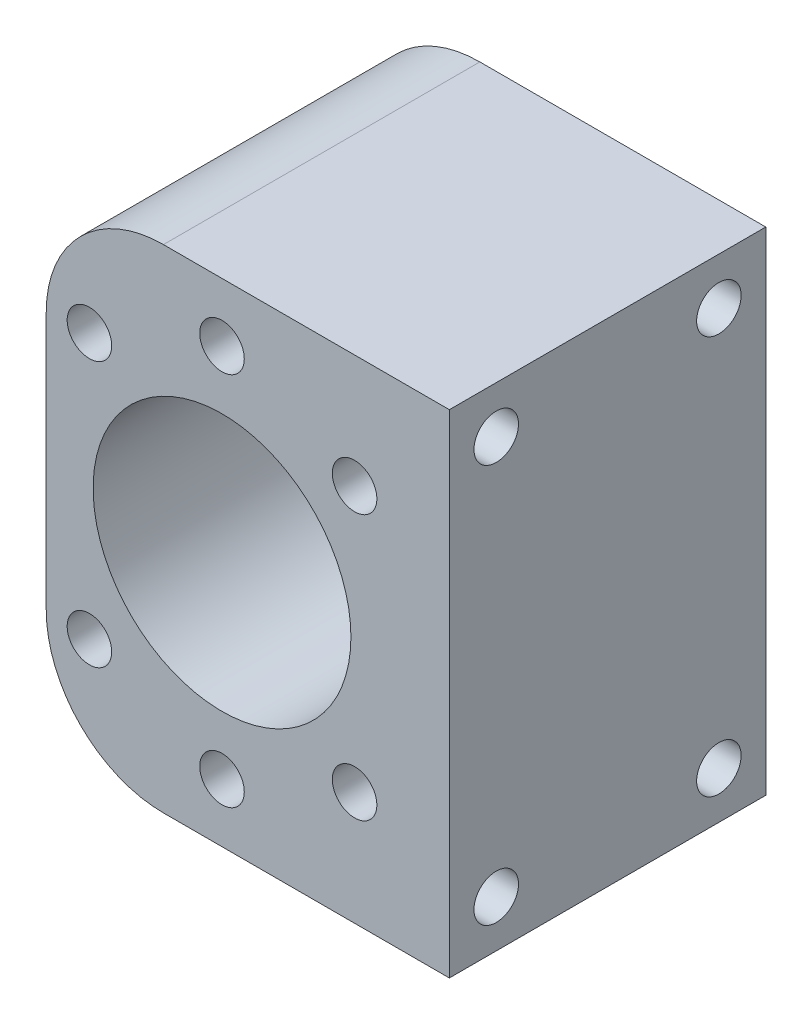
ISO-10303-21;
HEADER;
FILE_DESCRIPTION(('STEP AP214'),'2;1');
FILE_NAME('part.step','',(''),(''),'','','');
FILE_SCHEMA(('AUTOMOTIVE_DESIGN { 1 0 10303 214 1 1 1 1 }'));
ENDSEC;
DATA;
#1=APPLICATION_CONTEXT('core data for automotive mechanical design processes');
#2=APPLICATION_PROTOCOL_DEFINITION('international standard','automotive_design',2000,#1);
#3=PRODUCT_CONTEXT('',#1,'mechanical');
#4=PRODUCT('Part','Part','',(#3));
#5=PRODUCT_RELATED_PRODUCT_CATEGORY('part','',(#4));
#6=PRODUCT_DEFINITION_FORMATION('','',#4);
#7=PRODUCT_DEFINITION_CONTEXT('part definition',#1,'design');
#8=PRODUCT_DEFINITION('design','',#6,#7);
#9=PRODUCT_DEFINITION_SHAPE('','',#8);
#10=(LENGTH_UNIT() NAMED_UNIT(*) SI_UNIT(.MILLI.,.METRE.));
#11=(NAMED_UNIT(*) PLANE_ANGLE_UNIT() SI_UNIT($,.RADIAN.));
#12=(NAMED_UNIT(*) SI_UNIT($,.STERADIAN.) SOLID_ANGLE_UNIT());
#13=UNCERTAINTY_MEASURE_WITH_UNIT(LENGTH_MEASURE(1.E-05),#10,'distance_accuracy_value','');
#14=(GEOMETRIC_REPRESENTATION_CONTEXT(3) GLOBAL_UNCERTAINTY_ASSIGNED_CONTEXT((#13)) GLOBAL_UNIT_ASSIGNED_CONTEXT((#10,
#11,#12)) REPRESENTATION_CONTEXT('',''));
#15=CARTESIAN_POINT('',(0.,0.,0.));
#16=DIRECTION('',(0.,0.,1.));
#17=DIRECTION('',(1.,0.,0.));
#18=AXIS2_PLACEMENT_3D('',#15,#16,#17);
#19=CARTESIAN_POINT('',(-15.,21.,13.5));
#20=DIRECTION('',(0.,-1.,0.));
#21=DIRECTION('',(0.,0.,-1.));
#22=AXIS2_PLACEMENT_3D('',#19,#20,#21);
#23=PLANE('',#22);
#24=DIRECTION('',(-1.,0.,0.));
#25=VECTOR('',#24,1.);
#26=CARTESIAN_POINT('',(-15.,21.,-13.5));
#27=LINE('',#26,#25);
#28=CARTESIAN_POINT('',(19.4,21.,-13.5));
#29=VERTEX_POINT('',#28);
#30=CARTESIAN_POINT('',(-4.99999999999999,21.,-13.5));
#31=VERTEX_POINT('',#30);
#32=EDGE_CURVE('E88',#29,#31,#27,.T.);
#33=ORIENTED_EDGE('',*,*,#32,.T.);
#34=DIRECTION('',(0.,0.,-1.));
#35=VECTOR('',#34,1.);
#36=CARTESIAN_POINT('',(-4.99999999999999,21.,13.5));
#37=LINE('',#36,#35);
#38=CARTESIAN_POINT('',(-4.99999999999999,21.,13.5));
#39=VERTEX_POINT('',#38);
#40=EDGE_CURVE('E11',#31,#39,#37,.F.);
#41=ORIENTED_EDGE('',*,*,#40,.T.);
#42=DIRECTION('',(-1.,0.,0.));
#43=VECTOR('',#42,1.);
#44=CARTESIAN_POINT('',(-15.,21.,13.5));
#45=LINE('',#44,#43);
#46=CARTESIAN_POINT('',(19.4,21.,13.5));
#47=VERTEX_POINT('',#46);
#48=EDGE_CURVE('E101',#47,#39,#45,.T.);
#49=ORIENTED_EDGE('',*,*,#48,.F.);
#50=DIRECTION('',(0.,0.,1.));
#51=VECTOR('',#50,1.);
#52=CARTESIAN_POINT('',(19.4,21.,-13.5));
#53=LINE('',#52,#51);
#54=EDGE_CURVE('E100',#29,#47,#53,.T.);
#55=ORIENTED_EDGE('',*,*,#54,.F.);
#56=EDGE_LOOP('',(#33,#41,#49,#55));
#57=FACE_BOUND('',#56,.T.);
#58=ADVANCED_FACE('F35',(#57),#23,.F.);
#59=CARTESIAN_POINT('',(-15.,-21.,13.5));
#60=DIRECTION('',(1.,0.,0.));
#61=DIRECTION('',(0.,0.,-1.));
#62=AXIS2_PLACEMENT_3D('',#59,#60,#61);
#63=PLANE('',#62);
#64=DIRECTION('',(0.,-1.,0.));
#65=VECTOR('',#64,1.);
#66=CARTESIAN_POINT('',(-15.,-21.,-13.5));
#67=LINE('',#66,#65);
#68=CARTESIAN_POINT('',(-15.,11.,-13.5));
#69=VERTEX_POINT('',#68);
#70=CARTESIAN_POINT('',(-15.,-11.,-13.5));
#71=VERTEX_POINT('',#70);
#72=EDGE_CURVE('E96',#69,#71,#67,.T.);
#73=ORIENTED_EDGE('',*,*,#72,.T.);
#74=DIRECTION('',(0.,0.,-1.));
#75=VECTOR('',#74,1.);
#76=CARTESIAN_POINT('',(-15.,-11.,13.5));
#77=LINE('',#76,#75);
#78=CARTESIAN_POINT('',(-15.,-11.,13.5));
#79=VERTEX_POINT('',#78);
#80=EDGE_CURVE('E56',#71,#79,#77,.F.);
#81=ORIENTED_EDGE('',*,*,#80,.T.);
#82=DIRECTION('',(0.,-1.,0.));
#83=VECTOR('',#82,1.);
#84=CARTESIAN_POINT('',(-15.,-21.,13.5));
#85=LINE('',#84,#83);
#86=CARTESIAN_POINT('',(-15.,11.,13.5));
#87=VERTEX_POINT('',#86);
#88=EDGE_CURVE('E162',#87,#79,#85,.T.);
#89=ORIENTED_EDGE('',*,*,#88,.F.);
#90=DIRECTION('',(0.,0.,-1.));
#91=VECTOR('',#90,1.);
#92=CARTESIAN_POINT('',(-15.,11.,13.5));
#93=LINE('',#92,#91);
#94=EDGE_CURVE('E175',#87,#69,#93,.T.);
#95=ORIENTED_EDGE('',*,*,#94,.T.);
#96=EDGE_LOOP('',(#73,#81,#89,#95));
#97=FACE_BOUND('',#96,.T.);
#98=ADVANCED_FACE('F189',(#97),#63,.F.);
#99=CARTESIAN_POINT('',(-15.,-21.,13.5));
#100=DIRECTION('',(0.,1.,0.));
#101=DIRECTION('',(0.,0.,1.));
#102=AXIS2_PLACEMENT_3D('',#99,#100,#101);
#103=PLANE('',#102);
#104=DIRECTION('',(1.,0.,0.));
#105=VECTOR('',#104,1.);
#106=CARTESIAN_POINT('',(-15.,-21.,13.5));
#107=LINE('',#106,#105);
#108=CARTESIAN_POINT('',(-4.99999999999999,-21.,13.5));
#109=VERTEX_POINT('',#108);
#110=CARTESIAN_POINT('',(19.4,-21.,13.5));
#111=VERTEX_POINT('',#110);
#112=EDGE_CURVE('E165',#109,#111,#107,.T.);
#113=ORIENTED_EDGE('',*,*,#112,.F.);
#114=DIRECTION('',(0.,0.,-1.));
#115=VECTOR('',#114,1.);
#116=CARTESIAN_POINT('',(-4.99999999999999,-21.,13.5));
#117=LINE('',#116,#115);
#118=CARTESIAN_POINT('',(-4.99999999999999,-21.,-13.5));
#119=VERTEX_POINT('',#118);
#120=EDGE_CURVE('E166',#109,#119,#117,.T.);
#121=ORIENTED_EDGE('',*,*,#120,.T.);
#122=DIRECTION('',(1.,0.,0.));
#123=VECTOR('',#122,1.);
#124=CARTESIAN_POINT('',(-15.,-21.,-13.5));
#125=LINE('',#124,#123);
#126=CARTESIAN_POINT('',(19.4,-21.,-13.5));
#127=VERTEX_POINT('',#126);
#128=EDGE_CURVE('E163',#119,#127,#125,.T.);
#129=ORIENTED_EDGE('',*,*,#128,.T.);
#130=DIRECTION('',(0.,0.,-1.));
#131=VECTOR('',#130,1.);
#132=CARTESIAN_POINT('',(19.4,-21.,-13.5));
#133=LINE('',#132,#131);
#134=EDGE_CURVE('E110',#111,#127,#133,.T.);
#135=ORIENTED_EDGE('',*,*,#134,.F.);
#136=EDGE_LOOP('',(#113,#121,#129,#135));
#137=FACE_BOUND('',#136,.T.);
#138=ADVANCED_FACE('F187',(#137),#103,.F.);
#139=CARTESIAN_POINT('',(0.,0.,13.5));
#140=DIRECTION('',(0.,0.,-1.));
#141=DIRECTION('',(-1.,0.,0.));
#142=AXIS2_PLACEMENT_3D('',#139,#140,#141);
#143=PLANE('',#142);
#144=CARTESIAN_POINT('',(-11.3137084989847,-11.3137084989848,13.5));
#145=DIRECTION('',(0.,0.,1.));
#146=DIRECTION('',(1.,0.,0.));
#147=AXIS2_PLACEMENT_3D('',#144,#145,#146);
#148=CIRCLE('',#147,1.9);
#149=CARTESIAN_POINT('',(-9.4137084989847,-11.3137084989848,13.5));
#150=VERTEX_POINT('',#149);
#151=EDGE_CURVE('E120',#150,#150,#148,.T.);
#152=ORIENTED_EDGE('',*,*,#151,.F.);
#153=EDGE_LOOP('',(#152));
#154=FACE_BOUND('',#153,.T.);
#155=CARTESIAN_POINT('',(0.,-16.,13.5));
#156=DIRECTION('',(0.,0.,1.));
#157=DIRECTION('',(1.,0.,0.));
#158=AXIS2_PLACEMENT_3D('',#155,#156,#157);
#159=CIRCLE('',#158,1.9);
#160=CARTESIAN_POINT('',(1.9,-16.,13.5));
#161=VERTEX_POINT('',#160);
#162=EDGE_CURVE('E124',#161,#161,#159,.T.);
#163=ORIENTED_EDGE('',*,*,#162,.F.);
#164=EDGE_LOOP('',(#163));
#165=FACE_BOUND('',#164,.T.);
#166=CARTESIAN_POINT('',(11.3137084989847,-11.3137084989848,13.5));
#167=DIRECTION('',(0.,0.,1.));
#168=DIRECTION('',(1.,0.,0.));
#169=AXIS2_PLACEMENT_3D('',#166,#167,#168);
#170=CIRCLE('',#169,1.9);
#171=CARTESIAN_POINT('',(13.2137084989847,-11.3137084989848,13.5));
#172=VERTEX_POINT('',#171);
#173=EDGE_CURVE('E130',#172,#172,#170,.T.);
#174=ORIENTED_EDGE('',*,*,#173,.F.);
#175=EDGE_LOOP('',(#174));
#176=FACE_BOUND('',#175,.T.);
#177=CARTESIAN_POINT('',(11.3137084989847,11.3137084989848,13.5));
#178=DIRECTION('',(0.,0.,1.));
#179=DIRECTION('',(1.,0.,0.));
#180=AXIS2_PLACEMENT_3D('',#177,#178,#179);
#181=CIRCLE('',#180,1.9);
#182=CARTESIAN_POINT('',(13.2137084989847,11.3137084989848,13.5));
#183=VERTEX_POINT('',#182);
#184=EDGE_CURVE('E136',#183,#183,#181,.T.);
#185=ORIENTED_EDGE('',*,*,#184,.F.);
#186=EDGE_LOOP('',(#185));
#187=FACE_BOUND('',#186,.T.);
#188=CARTESIAN_POINT('',(0.,16.,13.5));
#189=DIRECTION('',(0.,0.,1.));
#190=DIRECTION('',(1.,0.,0.));
#191=AXIS2_PLACEMENT_3D('',#188,#189,#190);
#192=CIRCLE('',#191,1.9);
#193=CARTESIAN_POINT('',(1.9,16.,13.5));
#194=VERTEX_POINT('',#193);
#195=EDGE_CURVE('E142',#194,#194,#192,.T.);
#196=ORIENTED_EDGE('',*,*,#195,.F.);
#197=EDGE_LOOP('',(#196));
#198=FACE_BOUND('',#197,.T.);
#199=CARTESIAN_POINT('',(-11.3137084989847,11.3137084989848,13.5));
#200=DIRECTION('',(0.,0.,1.));
#201=DIRECTION('',(1.,0.,0.));
#202=AXIS2_PLACEMENT_3D('',#199,#200,#201);
#203=CIRCLE('',#202,1.9);
#204=CARTESIAN_POINT('',(-9.4137084989847,11.3137084989848,13.5));
#205=VERTEX_POINT('',#204);
#206=EDGE_CURVE('E148',#205,#205,#203,.T.);
#207=ORIENTED_EDGE('',*,*,#206,.F.);
#208=EDGE_LOOP('',(#207));
#209=FACE_BOUND('',#208,.T.);
#210=CARTESIAN_POINT('',(0.,0.,13.5));
#211=DIRECTION('',(0.,0.,1.));
#212=DIRECTION('',(1.,0.,0.));
#213=AXIS2_PLACEMENT_3D('',#210,#211,#212);
#214=CIRCLE('',#213,11.);
#215=CARTESIAN_POINT('',(11.,0.,13.5));
#216=VERTEX_POINT('',#215);
#217=EDGE_CURVE('E154',#216,#216,#214,.T.);
#218=ORIENTED_EDGE('',*,*,#217,.F.);
#219=EDGE_LOOP('',(#218));
#220=FACE_BOUND('',#219,.T.);
#221=ORIENTED_EDGE('',*,*,#88,.T.);
#222=CARTESIAN_POINT('',(-4.99999999999999,-11.,13.5));
#223=DIRECTION('',(0.,0.,-1.));
#224=DIRECTION('',(-1.,0.,0.));
#225=AXIS2_PLACEMENT_3D('',#222,#223,#224);
#226=CIRCLE('',#225,10.);
#227=EDGE_CURVE('E43',#79,#109,#226,.F.);
#228=ORIENTED_EDGE('',*,*,#227,.T.);
#229=ORIENTED_EDGE('',*,*,#112,.T.);
#230=DIRECTION('',(0.,-1.,0.));
#231=VECTOR('',#230,1.);
#232=CARTESIAN_POINT('',(19.4,21.,13.5));
#233=LINE('',#232,#231);
#234=EDGE_CURVE('E105',#47,#111,#233,.T.);
#235=ORIENTED_EDGE('',*,*,#234,.F.);
#236=ORIENTED_EDGE('',*,*,#48,.T.);
#237=CARTESIAN_POINT('',(-4.99999999999999,11.,13.5));
#238=DIRECTION('',(0.,0.,-1.));
#239=DIRECTION('',(-1.,0.,0.));
#240=AXIS2_PLACEMENT_3D('',#237,#238,#239);
#241=CIRCLE('',#240,10.);
#242=EDGE_CURVE('E179',#39,#87,#241,.F.);
#243=ORIENTED_EDGE('',*,*,#242,.T.);
#244=EDGE_LOOP('',(#221,#228,#229,#235,#236,#243));
#245=FACE_BOUND('',#244,.T.);
#246=ADVANCED_FACE('F183',(#154,#165,#176,#187,#198,#209,#220,#245),#143,.F.);
#247=CARTESIAN_POINT('',(0.,0.,-13.5));
#248=DIRECTION('',(0.,0.,-1.));
#249=DIRECTION('',(-1.,0.,0.));
#250=AXIS2_PLACEMENT_3D('',#247,#248,#249);
#251=PLANE('',#250);
#252=CARTESIAN_POINT('',(0.,0.,-13.5));
#253=DIRECTION('',(0.,0.,1.));
#254=DIRECTION('',(1.,0.,0.));
#255=AXIS2_PLACEMENT_3D('',#252,#253,#254);
#256=CIRCLE('',#255,11.);
#257=CARTESIAN_POINT('',(11.,0.,-13.5));
#258=VERTEX_POINT('',#257);
#259=EDGE_CURVE('E97',#258,#258,#256,.T.);
#260=ORIENTED_EDGE('',*,*,#259,.T.);
#261=EDGE_LOOP('',(#260));
#262=FACE_BOUND('',#261,.T.);
#263=ORIENTED_EDGE('',*,*,#128,.F.);
#264=CARTESIAN_POINT('',(-4.99999999999999,-11.,-13.5));
#265=DIRECTION('',(0.,0.,-1.));
#266=DIRECTION('',(-1.,0.,0.));
#267=AXIS2_PLACEMENT_3D('',#264,#265,#266);
#268=CIRCLE('',#267,10.);
#269=EDGE_CURVE('E173',#119,#71,#268,.T.);
#270=ORIENTED_EDGE('',*,*,#269,.T.);
#271=ORIENTED_EDGE('',*,*,#72,.F.);
#272=CARTESIAN_POINT('',(-4.99999999999999,11.,-13.5));
#273=DIRECTION('',(0.,0.,-1.));
#274=DIRECTION('',(-1.,0.,0.));
#275=AXIS2_PLACEMENT_3D('',#272,#273,#274);
#276=CIRCLE('',#275,10.);
#277=EDGE_CURVE('E95',#69,#31,#276,.T.);
#278=ORIENTED_EDGE('',*,*,#277,.T.);
#279=ORIENTED_EDGE('',*,*,#32,.F.);
#280=DIRECTION('',(0.,1.,0.));
#281=VECTOR('',#280,1.);
#282=CARTESIAN_POINT('',(19.4,21.,-13.5));
#283=LINE('',#282,#281);
#284=EDGE_CURVE('E93',#127,#29,#283,.T.);
#285=ORIENTED_EDGE('',*,*,#284,.F.);
#286=EDGE_LOOP('',(#263,#270,#271,#278,#279,#285));
#287=FACE_BOUND('',#286,.T.);
#288=ADVANCED_FACE('F91',(#262,#287),#251,.T.);
#289=CARTESIAN_POINT('',(0.,0.,-13.5));
#290=DIRECTION('',(0.,0.,1.));
#291=DIRECTION('',(1.,0.,0.));
#292=AXIS2_PLACEMENT_3D('',#289,#290,#291);
#293=CYLINDRICAL_SURFACE('',#292,11.);
#294=ORIENTED_EDGE('',*,*,#259,.F.);
#295=EDGE_LOOP('',(#294));
#296=FACE_BOUND('',#295,.T.);
#297=ORIENTED_EDGE('',*,*,#217,.T.);
#298=EDGE_LOOP('',(#297));
#299=FACE_BOUND('',#298,.T.);
#300=ADVANCED_FACE('F210',(#296,#299),#293,.F.);
#301=CARTESIAN_POINT('',(-11.3137084989847,11.3137084989848,3.5));
#302=DIRECTION('',(0.,0.,1.));
#303=DIRECTION('',(1.,0.,0.));
#304=AXIS2_PLACEMENT_3D('',#301,#302,#303);
#305=CYLINDRICAL_SURFACE('',#304,1.9);
#306=CARTESIAN_POINT('',(-11.3137084989847,11.3137084989848,3.5));
#307=DIRECTION('',(0.,0.,1.));
#308=DIRECTION('',(1.,0.,0.));
#309=AXIS2_PLACEMENT_3D('',#306,#307,#308);
#310=CIRCLE('',#309,1.9);
#311=CARTESIAN_POINT('',(-9.4137084989847,11.3137084989848,3.5));
#312=VERTEX_POINT('',#311);
#313=EDGE_CURVE('E151',#312,#312,#310,.T.);
#314=ORIENTED_EDGE('',*,*,#313,.F.);
#315=EDGE_LOOP('',(#314));
#316=FACE_BOUND('',#315,.T.);
#317=ORIENTED_EDGE('',*,*,#206,.T.);
#318=EDGE_LOOP('',(#317));
#319=FACE_BOUND('',#318,.T.);
#320=ADVANCED_FACE('F217',(#316,#319),#305,.F.);
#321=CARTESIAN_POINT('',(-11.3137084989847,11.3137084989848,3.5));
#322=DIRECTION('',(0.,0.,1.));
#323=DIRECTION('',(1.,0.,0.));
#324=AXIS2_PLACEMENT_3D('',#321,#322,#323);
#325=PLANE('',#324);
#326=ORIENTED_EDGE('',*,*,#313,.T.);
#327=EDGE_LOOP('',(#326));
#328=FACE_BOUND('',#327,.T.);
#329=ADVANCED_FACE('F221',(#328),#325,.T.);
#330=CARTESIAN_POINT('',(0.,16.,3.5));
#331=DIRECTION('',(0.,0.,1.));
#332=DIRECTION('',(1.,0.,0.));
#333=AXIS2_PLACEMENT_3D('',#330,#331,#332);
#334=CYLINDRICAL_SURFACE('',#333,1.9);
#335=CARTESIAN_POINT('',(0.,16.,3.5));
#336=DIRECTION('',(0.,0.,1.));
#337=DIRECTION('',(1.,0.,0.));
#338=AXIS2_PLACEMENT_3D('',#335,#336,#337);
#339=CIRCLE('',#338,1.9);
#340=CARTESIAN_POINT('',(1.9,16.,3.5));
#341=VERTEX_POINT('',#340);
#342=EDGE_CURVE('E145',#341,#341,#339,.T.);
#343=ORIENTED_EDGE('',*,*,#342,.F.);
#344=EDGE_LOOP('',(#343));
#345=FACE_BOUND('',#344,.T.);
#346=ORIENTED_EDGE('',*,*,#195,.T.);
#347=EDGE_LOOP('',(#346));
#348=FACE_BOUND('',#347,.T.);
#349=ADVANCED_FACE('F225',(#345,#348),#334,.F.);
#350=CARTESIAN_POINT('',(0.,16.,3.5));
#351=DIRECTION('',(0.,0.,1.));
#352=DIRECTION('',(1.,0.,0.));
#353=AXIS2_PLACEMENT_3D('',#350,#351,#352);
#354=PLANE('',#353);
#355=ORIENTED_EDGE('',*,*,#342,.T.);
#356=EDGE_LOOP('',(#355));
#357=FACE_BOUND('',#356,.T.);
#358=ADVANCED_FACE('F229',(#357),#354,.T.);
#359=CARTESIAN_POINT('',(11.3137084989847,11.3137084989848,3.5));
#360=DIRECTION('',(0.,0.,1.));
#361=DIRECTION('',(1.,0.,0.));
#362=AXIS2_PLACEMENT_3D('',#359,#360,#361);
#363=CYLINDRICAL_SURFACE('',#362,1.9);
#364=CARTESIAN_POINT('',(11.3137084989847,11.3137084989848,3.5));
#365=DIRECTION('',(0.,0.,1.));
#366=DIRECTION('',(1.,0.,0.));
#367=AXIS2_PLACEMENT_3D('',#364,#365,#366);
#368=CIRCLE('',#367,1.9);
#369=CARTESIAN_POINT('',(13.2137084989847,11.3137084989848,3.5));
#370=VERTEX_POINT('',#369);
#371=EDGE_CURVE('E139',#370,#370,#368,.T.);
#372=ORIENTED_EDGE('',*,*,#371,.F.);
#373=EDGE_LOOP('',(#372));
#374=FACE_BOUND('',#373,.T.);
#375=ORIENTED_EDGE('',*,*,#184,.T.);
#376=EDGE_LOOP('',(#375));
#377=FACE_BOUND('',#376,.T.);
#378=ADVANCED_FACE('F233',(#374,#377),#363,.F.);
#379=CARTESIAN_POINT('',(11.3137084989847,11.3137084989848,3.5));
#380=DIRECTION('',(0.,0.,1.));
#381=DIRECTION('',(1.,0.,0.));
#382=AXIS2_PLACEMENT_3D('',#379,#380,#381);
#383=PLANE('',#382);
#384=ORIENTED_EDGE('',*,*,#371,.T.);
#385=EDGE_LOOP('',(#384));
#386=FACE_BOUND('',#385,.T.);
#387=ADVANCED_FACE('F237',(#386),#383,.T.);
#388=CARTESIAN_POINT('',(11.3137084989847,-11.3137084989848,3.5));
#389=DIRECTION('',(0.,0.,1.));
#390=DIRECTION('',(1.,0.,0.));
#391=AXIS2_PLACEMENT_3D('',#388,#389,#390);
#392=CYLINDRICAL_SURFACE('',#391,1.9);
#393=CARTESIAN_POINT('',(11.3137084989847,-11.3137084989848,3.5));
#394=DIRECTION('',(0.,0.,1.));
#395=DIRECTION('',(1.,0.,0.));
#396=AXIS2_PLACEMENT_3D('',#393,#394,#395);
#397=CIRCLE('',#396,1.9);
#398=CARTESIAN_POINT('',(13.2137084989847,-11.3137084989848,3.5));
#399=VERTEX_POINT('',#398);
#400=EDGE_CURVE('E133',#399,#399,#397,.T.);
#401=ORIENTED_EDGE('',*,*,#400,.F.);
#402=EDGE_LOOP('',(#401));
#403=FACE_BOUND('',#402,.T.);
#404=ORIENTED_EDGE('',*,*,#173,.T.);
#405=EDGE_LOOP('',(#404));
#406=FACE_BOUND('',#405,.T.);
#407=ADVANCED_FACE('F241',(#403,#406),#392,.F.);
#408=CARTESIAN_POINT('',(11.3137084989847,-11.3137084989848,3.5));
#409=DIRECTION('',(0.,0.,1.));
#410=DIRECTION('',(1.,0.,0.));
#411=AXIS2_PLACEMENT_3D('',#408,#409,#410);
#412=PLANE('',#411);
#413=ORIENTED_EDGE('',*,*,#400,.T.);
#414=EDGE_LOOP('',(#413));
#415=FACE_BOUND('',#414,.T.);
#416=ADVANCED_FACE('F245',(#415),#412,.T.);
#417=CARTESIAN_POINT('',(0.,-16.,3.5));
#418=DIRECTION('',(0.,0.,1.));
#419=DIRECTION('',(1.,0.,0.));
#420=AXIS2_PLACEMENT_3D('',#417,#418,#419);
#421=CYLINDRICAL_SURFACE('',#420,1.9);
#422=CARTESIAN_POINT('',(0.,-16.,3.5));
#423=DIRECTION('',(0.,0.,1.));
#424=DIRECTION('',(1.,0.,0.));
#425=AXIS2_PLACEMENT_3D('',#422,#423,#424);
#426=CIRCLE('',#425,1.9);
#427=CARTESIAN_POINT('',(1.9,-16.,3.5));
#428=VERTEX_POINT('',#427);
#429=EDGE_CURVE('E127',#428,#428,#426,.T.);
#430=ORIENTED_EDGE('',*,*,#429,.F.);
#431=EDGE_LOOP('',(#430));
#432=FACE_BOUND('',#431,.T.);
#433=ORIENTED_EDGE('',*,*,#162,.T.);
#434=EDGE_LOOP('',(#433));
#435=FACE_BOUND('',#434,.T.);
#436=ADVANCED_FACE('F249',(#432,#435),#421,.F.);
#437=CARTESIAN_POINT('',(0.,-16.,3.5));
#438=DIRECTION('',(0.,0.,1.));
#439=DIRECTION('',(1.,0.,0.));
#440=AXIS2_PLACEMENT_3D('',#437,#438,#439);
#441=PLANE('',#440);
#442=ORIENTED_EDGE('',*,*,#429,.T.);
#443=EDGE_LOOP('',(#442));
#444=FACE_BOUND('',#443,.T.);
#445=ADVANCED_FACE('F253',(#444),#441,.T.);
#446=CARTESIAN_POINT('',(-11.3137084989847,-11.3137084989848,3.5));
#447=DIRECTION('',(0.,0.,1.));
#448=DIRECTION('',(1.,0.,0.));
#449=AXIS2_PLACEMENT_3D('',#446,#447,#448);
#450=CYLINDRICAL_SURFACE('',#449,1.9);
#451=CARTESIAN_POINT('',(-11.3137084989847,-11.3137084989848,3.5));
#452=DIRECTION('',(0.,0.,1.));
#453=DIRECTION('',(1.,0.,0.));
#454=AXIS2_PLACEMENT_3D('',#451,#452,#453);
#455=CIRCLE('',#454,1.9);
#456=CARTESIAN_POINT('',(-9.4137084989847,-11.3137084989848,3.5));
#457=VERTEX_POINT('',#456);
#458=EDGE_CURVE('E121',#457,#457,#455,.T.);
#459=ORIENTED_EDGE('',*,*,#458,.F.);
#460=EDGE_LOOP('',(#459));
#461=FACE_BOUND('',#460,.T.);
#462=ORIENTED_EDGE('',*,*,#151,.T.);
#463=EDGE_LOOP('',(#462));
#464=FACE_BOUND('',#463,.T.);
#465=ADVANCED_FACE('F257',(#461,#464),#450,.F.);
#466=CARTESIAN_POINT('',(-11.3137084989847,-11.3137084989848,3.5));
#467=DIRECTION('',(0.,0.,1.));
#468=DIRECTION('',(1.,0.,0.));
#469=AXIS2_PLACEMENT_3D('',#466,#467,#468);
#470=PLANE('',#469);
#471=ORIENTED_EDGE('',*,*,#458,.T.);
#472=EDGE_LOOP('',(#471));
#473=FACE_BOUND('',#472,.T.);
#474=ADVANCED_FACE('F261',(#473),#470,.T.);
#475=CARTESIAN_POINT('',(19.4,0.,0.));
#476=DIRECTION('',(-1.,0.,0.));
#477=DIRECTION('',(0.,0.,1.));
#478=AXIS2_PLACEMENT_3D('',#475,#476,#477);
#479=PLANE('',#478);
#480=CARTESIAN_POINT('',(19.4,-17.,9.5));
#481=DIRECTION('',(1.,0.,0.));
#482=DIRECTION('',(0.,0.,-1.));
#483=AXIS2_PLACEMENT_3D('',#480,#481,#482);
#484=CIRCLE('',#483,1.9);
#485=CARTESIAN_POINT('',(19.4,-17.,7.6));
#486=VERTEX_POINT('',#485);
#487=EDGE_CURVE('E304',#486,#486,#484,.T.);
#488=ORIENTED_EDGE('',*,*,#487,.F.);
#489=EDGE_LOOP('',(#488));
#490=FACE_BOUND('',#489,.T.);
#491=CARTESIAN_POINT('',(19.4,-17.,-9.49999999999999));
#492=DIRECTION('',(1.,0.,0.));
#493=DIRECTION('',(0.,0.,-1.));
#494=AXIS2_PLACEMENT_3D('',#491,#492,#493);
#495=CIRCLE('',#494,1.9);
#496=CARTESIAN_POINT('',(19.4,-17.,-11.4));
#497=VERTEX_POINT('',#496);
#498=EDGE_CURVE('E303',#497,#497,#495,.T.);
#499=ORIENTED_EDGE('',*,*,#498,.F.);
#500=EDGE_LOOP('',(#499));
#501=FACE_BOUND('',#500,.T.);
#502=CARTESIAN_POINT('',(19.4,17.,9.5));
#503=DIRECTION('',(1.,0.,0.));
#504=DIRECTION('',(0.,0.,-1.));
#505=AXIS2_PLACEMENT_3D('',#502,#503,#504);
#506=CIRCLE('',#505,1.9);
#507=CARTESIAN_POINT('',(19.4,17.,7.6));
#508=VERTEX_POINT('',#507);
#509=EDGE_CURVE('E313',#508,#508,#506,.T.);
#510=ORIENTED_EDGE('',*,*,#509,.F.);
#511=EDGE_LOOP('',(#510));
#512=FACE_BOUND('',#511,.T.);
#513=CARTESIAN_POINT('',(19.4,17.,-9.5));
#514=DIRECTION('',(1.,0.,0.));
#515=DIRECTION('',(0.,0.,-1.));
#516=AXIS2_PLACEMENT_3D('',#513,#514,#515);
#517=CIRCLE('',#516,1.9);
#518=CARTESIAN_POINT('',(19.4,17.,-11.4));
#519=VERTEX_POINT('',#518);
#520=EDGE_CURVE('E114',#519,#519,#517,.T.);
#521=ORIENTED_EDGE('',*,*,#520,.F.);
#522=EDGE_LOOP('',(#521));
#523=FACE_BOUND('',#522,.T.);
#524=ORIENTED_EDGE('',*,*,#284,.T.);
#525=ORIENTED_EDGE('',*,*,#54,.T.);
#526=ORIENTED_EDGE('',*,*,#234,.T.);
#527=ORIENTED_EDGE('',*,*,#134,.T.);
#528=EDGE_LOOP('',(#524,#525,#526,#527));
#529=FACE_BOUND('',#528,.T.);
#530=ADVANCED_FACE('F108',(#490,#501,#512,#523,#529),#479,.F.);
#531=CARTESIAN_POINT('',(9.4,17.,-9.5));
#532=DIRECTION('',(1.,0.,0.));
#533=DIRECTION('',(0.,0.,-1.));
#534=AXIS2_PLACEMENT_3D('',#531,#532,#533);
#535=CYLINDRICAL_SURFACE('',#534,1.9);
#536=CARTESIAN_POINT('',(9.4,17.,-9.5));
#537=DIRECTION('',(1.,0.,0.));
#538=DIRECTION('',(0.,0.,-1.));
#539=AXIS2_PLACEMENT_3D('',#536,#537,#538);
#540=CIRCLE('',#539,1.9);
#541=CARTESIAN_POINT('',(9.4,17.,-11.4));
#542=VERTEX_POINT('',#541);
#543=EDGE_CURVE('E111',#542,#542,#540,.T.);
#544=ORIENTED_EDGE('',*,*,#543,.F.);
#545=EDGE_LOOP('',(#544));
#546=FACE_BOUND('',#545,.T.);
#547=ORIENTED_EDGE('',*,*,#520,.T.);
#548=EDGE_LOOP('',(#547));
#549=FACE_BOUND('',#548,.T.);
#550=ADVANCED_FACE('F268',(#546,#549),#535,.F.);
#551=CARTESIAN_POINT('',(9.4,17.,-9.5));
#552=DIRECTION('',(1.,0.,0.));
#553=DIRECTION('',(0.,0.,-1.));
#554=AXIS2_PLACEMENT_3D('',#551,#552,#553);
#555=PLANE('',#554);
#556=ORIENTED_EDGE('',*,*,#543,.T.);
#557=EDGE_LOOP('',(#556));
#558=FACE_BOUND('',#557,.T.);
#559=ADVANCED_FACE('F272',(#558),#555,.T.);
#560=CARTESIAN_POINT('',(9.4,17.,9.5));
#561=DIRECTION('',(1.,0.,0.));
#562=DIRECTION('',(0.,0.,-1.));
#563=AXIS2_PLACEMENT_3D('',#560,#561,#562);
#564=CYLINDRICAL_SURFACE('',#563,1.9);
#565=CARTESIAN_POINT('',(9.4,17.,9.5));
#566=DIRECTION('',(1.,0.,0.));
#567=DIRECTION('',(0.,0.,-1.));
#568=AXIS2_PLACEMENT_3D('',#565,#566,#567);
#569=CIRCLE('',#568,1.9);
#570=CARTESIAN_POINT('',(9.4,17.,7.6));
#571=VERTEX_POINT('',#570);
#572=EDGE_CURVE('E315',#571,#571,#569,.T.);
#573=ORIENTED_EDGE('',*,*,#572,.F.);
#574=EDGE_LOOP('',(#573));
#575=FACE_BOUND('',#574,.T.);
#576=ORIENTED_EDGE('',*,*,#509,.T.);
#577=EDGE_LOOP('',(#576));
#578=FACE_BOUND('',#577,.T.);
#579=ADVANCED_FACE('F276',(#575,#578),#564,.F.);
#580=CARTESIAN_POINT('',(9.4,17.,9.5));
#581=DIRECTION('',(1.,0.,0.));
#582=DIRECTION('',(0.,0.,-1.));
#583=AXIS2_PLACEMENT_3D('',#580,#581,#582);
#584=PLANE('',#583);
#585=ORIENTED_EDGE('',*,*,#572,.T.);
#586=EDGE_LOOP('',(#585));
#587=FACE_BOUND('',#586,.T.);
#588=ADVANCED_FACE('F280',(#587),#584,.T.);
#589=CARTESIAN_POINT('',(9.4,-17.,-9.49999999999999));
#590=DIRECTION('',(1.,0.,0.));
#591=DIRECTION('',(0.,0.,-1.));
#592=AXIS2_PLACEMENT_3D('',#589,#590,#591);
#593=CYLINDRICAL_SURFACE('',#592,1.9);
#594=CARTESIAN_POINT('',(9.4,-17.,-9.49999999999999));
#595=DIRECTION('',(1.,0.,0.));
#596=DIRECTION('',(0.,0.,-1.));
#597=AXIS2_PLACEMENT_3D('',#594,#595,#596);
#598=CIRCLE('',#597,1.9);
#599=CARTESIAN_POINT('',(9.4,-17.,-11.4));
#600=VERTEX_POINT('',#599);
#601=EDGE_CURVE('E307',#600,#600,#598,.T.);
#602=ORIENTED_EDGE('',*,*,#601,.F.);
#603=EDGE_LOOP('',(#602));
#604=FACE_BOUND('',#603,.T.);
#605=ORIENTED_EDGE('',*,*,#498,.T.);
#606=EDGE_LOOP('',(#605));
#607=FACE_BOUND('',#606,.T.);
#608=ADVANCED_FACE('F284',(#604,#607),#593,.F.);
#609=CARTESIAN_POINT('',(9.4,-17.,-9.49999999999999));
#610=DIRECTION('',(1.,0.,0.));
#611=DIRECTION('',(0.,0.,-1.));
#612=AXIS2_PLACEMENT_3D('',#609,#610,#611);
#613=PLANE('',#612);
#614=ORIENTED_EDGE('',*,*,#601,.T.);
#615=EDGE_LOOP('',(#614));
#616=FACE_BOUND('',#615,.T.);
#617=ADVANCED_FACE('F288',(#616),#613,.T.);
#618=CARTESIAN_POINT('',(9.4,-17.,9.5));
#619=DIRECTION('',(1.,0.,0.));
#620=DIRECTION('',(0.,0.,-1.));
#621=AXIS2_PLACEMENT_3D('',#618,#619,#620);
#622=CYLINDRICAL_SURFACE('',#621,1.9);
#623=CARTESIAN_POINT('',(9.4,-17.,9.5));
#624=DIRECTION('',(1.,0.,0.));
#625=DIRECTION('',(0.,0.,-1.));
#626=AXIS2_PLACEMENT_3D('',#623,#624,#625);
#627=CIRCLE('',#626,1.9);
#628=CARTESIAN_POINT('',(9.4,-17.,7.6));
#629=VERTEX_POINT('',#628);
#630=EDGE_CURVE('E302',#629,#629,#627,.T.);
#631=ORIENTED_EDGE('',*,*,#630,.F.);
#632=EDGE_LOOP('',(#631));
#633=FACE_BOUND('',#632,.T.);
#634=ORIENTED_EDGE('',*,*,#487,.T.);
#635=EDGE_LOOP('',(#634));
#636=FACE_BOUND('',#635,.T.);
#637=ADVANCED_FACE('F292',(#633,#636),#622,.F.);
#638=CARTESIAN_POINT('',(9.4,-17.,9.5));
#639=DIRECTION('',(1.,0.,0.));
#640=DIRECTION('',(0.,0.,-1.));
#641=AXIS2_PLACEMENT_3D('',#638,#639,#640);
#642=PLANE('',#641);
#643=ORIENTED_EDGE('',*,*,#630,.T.);
#644=EDGE_LOOP('',(#643));
#645=FACE_BOUND('',#644,.T.);
#646=ADVANCED_FACE('F197',(#645),#642,.T.);
#647=CARTESIAN_POINT('',(-4.99999999999999,-11.,13.5));
#648=DIRECTION('',(0.,0.,-1.));
#649=DIRECTION('',(-1.,0.,0.));
#650=AXIS2_PLACEMENT_3D('',#647,#648,#649);
#651=CYLINDRICAL_SURFACE('',#650,10.);
#652=ORIENTED_EDGE('',*,*,#227,.F.);
#653=ORIENTED_EDGE('',*,*,#80,.F.);
#654=ORIENTED_EDGE('',*,*,#269,.F.);
#655=ORIENTED_EDGE('',*,*,#120,.F.);
#656=EDGE_LOOP('',(#652,#653,#654,#655));
#657=FACE_BOUND('',#656,.T.);
#658=ADVANCED_FACE('F188',(#657),#651,.T.);
#659=CARTESIAN_POINT('',(-4.99999999999999,11.,13.5));
#660=DIRECTION('',(0.,0.,-1.));
#661=DIRECTION('',(-1.,0.,0.));
#662=AXIS2_PLACEMENT_3D('',#659,#660,#661);
#663=CYLINDRICAL_SURFACE('',#662,10.);
#664=ORIENTED_EDGE('',*,*,#242,.F.);
#665=ORIENTED_EDGE('',*,*,#40,.F.);
#666=ORIENTED_EDGE('',*,*,#277,.F.);
#667=ORIENTED_EDGE('',*,*,#94,.F.);
#668=EDGE_LOOP('',(#664,#665,#666,#667));
#669=FACE_BOUND('',#668,.T.);
#670=ADVANCED_FACE('F37',(#669),#663,.T.);
#671=CLOSED_SHELL('',(#58,#98,#138,#246,#288,#300,#320,#329,#349,#358,#378,#387,#407,#416,#436,
#445,#465,#474,#530,#550,#559,#579,#588,#608,#617,#637,#646,#658,#670));
#672=MANIFOLD_SOLID_BREP('B2',#671);
#673=ADVANCED_BREP_SHAPE_REPRESENTATION('',(#18,#672),#14);
#674=SHAPE_DEFINITION_REPRESENTATION(#9,#673);
ENDSEC;
END-ISO-10303-21;
